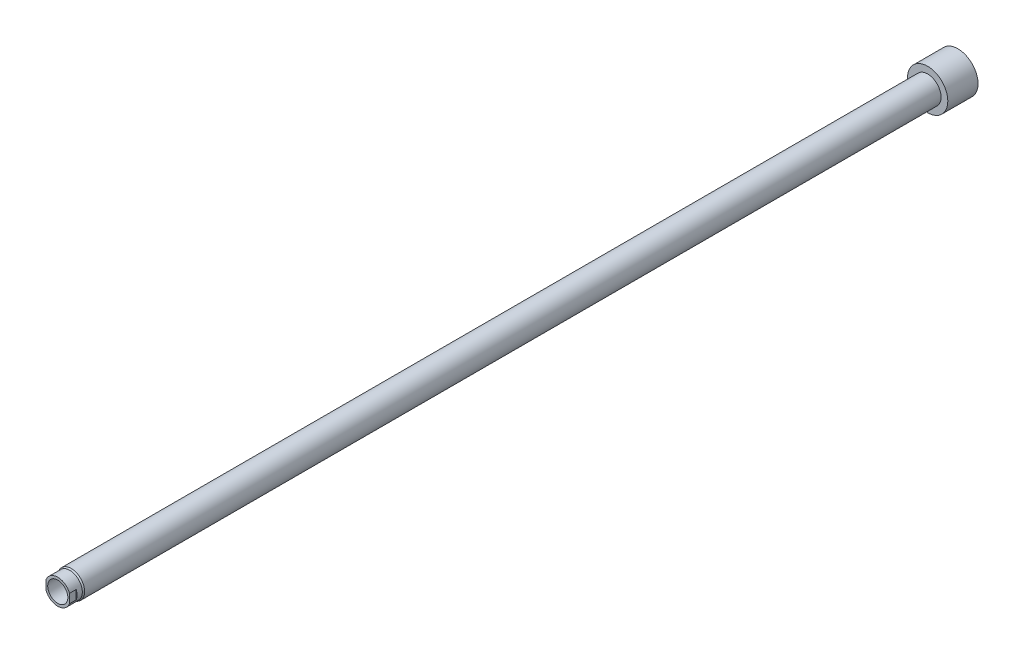
ISO-10303-21;
HEADER;
FILE_DESCRIPTION(('STEP AP214'),'2;1');
FILE_NAME('part.step','',(''),(''),'','','');
FILE_SCHEMA(('AUTOMOTIVE_DESIGN { 1 0 10303 214 1 1 1 1 }'));
ENDSEC;
DATA;
#1=APPLICATION_CONTEXT('core data for automotive mechanical design processes');
#2=APPLICATION_PROTOCOL_DEFINITION('international standard','automotive_design',2000,#1);
#3=PRODUCT_CONTEXT('',#1,'mechanical');
#4=PRODUCT('Part','Part','',(#3));
#5=PRODUCT_RELATED_PRODUCT_CATEGORY('part','',(#4));
#6=PRODUCT_DEFINITION_FORMATION('','',#4);
#7=PRODUCT_DEFINITION_CONTEXT('part definition',#1,'design');
#8=PRODUCT_DEFINITION('design','',#6,#7);
#9=PRODUCT_DEFINITION_SHAPE('','',#8);
#10=(LENGTH_UNIT() NAMED_UNIT(*) SI_UNIT(.MILLI.,.METRE.));
#11=(NAMED_UNIT(*) PLANE_ANGLE_UNIT() SI_UNIT($,.RADIAN.));
#12=(NAMED_UNIT(*) SI_UNIT($,.STERADIAN.) SOLID_ANGLE_UNIT());
#13=UNCERTAINTY_MEASURE_WITH_UNIT(LENGTH_MEASURE(1.E-05),#10,'distance_accuracy_value','');
#14=(GEOMETRIC_REPRESENTATION_CONTEXT(3) GLOBAL_UNCERTAINTY_ASSIGNED_CONTEXT((#13)) GLOBAL_UNIT_ASSIGNED_CONTEXT((#10,
#11,#12)) REPRESENTATION_CONTEXT('',''));
#15=CARTESIAN_POINT('',(0.,0.,0.));
#16=DIRECTION('',(0.,0.,1.));
#17=DIRECTION('',(1.,0.,0.));
#18=AXIS2_PLACEMENT_3D('',#15,#16,#17);
#19=CARTESIAN_POINT('',(0.,0.,38.1));
#20=DIRECTION('',(0.,0.,-1.));
#21=DIRECTION('',(-1.,0.,0.));
#22=AXIS2_PLACEMENT_3D('',#19,#20,#21);
#23=CYLINDRICAL_SURFACE('',#22,12.6999999999999);
#24=CARTESIAN_POINT('',(0.,0.,38.1));
#25=DIRECTION('',(0.,0.,1.));
#26=DIRECTION('',(1.,0.,0.));
#27=AXIS2_PLACEMENT_3D('',#24,#25,#26);
#28=CIRCLE('',#27,12.6999999999999);
#29=CARTESIAN_POINT('',(12.6999999999999,0.,38.1));
#30=VERTEX_POINT('',#29);
#31=EDGE_CURVE('E11',#30,#30,#28,.T.);
#32=ORIENTED_EDGE('',*,*,#31,.F.);
#33=EDGE_LOOP('',(#32));
#34=FACE_BOUND('',#33,.T.);
#35=CARTESIAN_POINT('',(0.,0.,-771.525));
#36=DIRECTION('',(0.,0.,1.));
#37=DIRECTION('',(1.,0.,0.));
#38=AXIS2_PLACEMENT_3D('',#35,#36,#37);
#39=CIRCLE('',#38,12.6999999999999);
#40=CARTESIAN_POINT('',(12.6999999999999,0.,-771.525));
#41=VERTEX_POINT('',#40);
#42=EDGE_CURVE('E122',#41,#41,#39,.T.);
#43=ORIENTED_EDGE('',*,*,#42,.T.);
#44=EDGE_LOOP('',(#43));
#45=FACE_BOUND('',#44,.T.);
#46=ADVANCED_FACE('F34',(#34,#45),#23,.T.);
#47=CARTESIAN_POINT('',(0.,0.,38.1));
#48=DIRECTION('',(0.,0.,-1.));
#49=DIRECTION('',(1.,0.,0.));
#50=AXIS2_PLACEMENT_3D('',#47,#48,#49);
#51=CONICAL_SURFACE('',#50,12.7000000000016,0.523598775599996);
#52=CARTESIAN_POINT('',(0.,0.,39.4748153285071));
#53=DIRECTION('',(0.,0.,1.));
#54=DIRECTION('',(1.,0.,0.));
#55=AXIS2_PLACEMENT_3D('',#52,#53,#54);
#56=CIRCLE('',#55,11.9062499999988);
#57=CARTESIAN_POINT('',(11.9062499999988,0.,39.4748153285071));
#58=VERTEX_POINT('',#57);
#59=EDGE_CURVE('E42',#58,#58,#56,.T.);
#60=ORIENTED_EDGE('',*,*,#59,.F.);
#61=EDGE_LOOP('',(#60));
#62=FACE_BOUND('',#61,.T.);
#63=ORIENTED_EDGE('',*,*,#31,.T.);
#64=EDGE_LOOP('',(#63));
#65=FACE_BOUND('',#64,.T.);
#66=ADVANCED_FACE('F112',(#62,#65),#51,.T.);
#67=CARTESIAN_POINT('',(0.,0.,50.8));
#68=DIRECTION('',(0.,0.,-1.));
#69=DIRECTION('',(-1.,0.,0.));
#70=AXIS2_PLACEMENT_3D('',#67,#68,#69);
#71=CYLINDRICAL_SURFACE('',#70,11.90625);
#72=CARTESIAN_POINT('',(0.,0.,50.8));
#73=DIRECTION('',(0.,0.,1.));
#74=DIRECTION('',(1.,0.,0.));
#75=AXIS2_PLACEMENT_3D('',#72,#73,#74);
#76=CIRCLE('',#75,11.90625);
#77=CARTESIAN_POINT('',(-11.1125,-4.27447456566303,50.8));
#78=VERTEX_POINT('',#77);
#79=CARTESIAN_POINT('',(11.1125,-4.27447456566302,50.8));
#80=VERTEX_POINT('',#79);
#81=EDGE_CURVE('E92',#78,#80,#76,.T.);
#82=ORIENTED_EDGE('',*,*,#81,.F.);
#83=DIRECTION('',(0.,0.,1.));
#84=VECTOR('',#83,1.);
#85=CARTESIAN_POINT('',(-11.1125,-4.27447456566302,44.45));
#86=LINE('',#85,#84);
#87=CARTESIAN_POINT('',(-11.1125,-4.27447456566302,44.45));
#88=VERTEX_POINT('',#87);
#89=EDGE_CURVE('E49',#88,#78,#86,.T.);
#90=ORIENTED_EDGE('',*,*,#89,.F.);
#91=CARTESIAN_POINT('',(0.,0.,44.45));
#92=DIRECTION('',(0.,0.,1.));
#93=DIRECTION('',(1.,0.,0.));
#94=AXIS2_PLACEMENT_3D('',#91,#92,#93);
#95=CIRCLE('',#94,11.90625);
#96=CARTESIAN_POINT('',(-11.1125,4.27447456566302,44.45));
#97=VERTEX_POINT('',#96);
#98=EDGE_CURVE('E78',#97,#88,#95,.T.);
#99=ORIENTED_EDGE('',*,*,#98,.F.);
#100=DIRECTION('',(0.,0.,1.));
#101=VECTOR('',#100,1.);
#102=CARTESIAN_POINT('',(-11.1125,4.27447456566302,44.45));
#103=LINE('',#102,#101);
#104=CARTESIAN_POINT('',(-11.1125,4.27447456566302,50.8));
#105=VERTEX_POINT('',#104);
#106=EDGE_CURVE('E86',#97,#105,#103,.T.);
#107=ORIENTED_EDGE('',*,*,#106,.T.);
#108=CARTESIAN_POINT('',(11.1125,4.27447456566303,50.8));
#109=VERTEX_POINT('',#108);
#110=EDGE_CURVE('E107',#109,#105,#76,.T.);
#111=ORIENTED_EDGE('',*,*,#110,.F.);
#112=DIRECTION('',(0.,0.,1.));
#113=VECTOR('',#112,1.);
#114=CARTESIAN_POINT('',(11.1125,4.27447456566302,44.45));
#115=LINE('',#114,#113);
#116=CARTESIAN_POINT('',(11.1125,4.27447456566302,44.45));
#117=VERTEX_POINT('',#116);
#118=EDGE_CURVE('E57',#117,#109,#115,.T.);
#119=ORIENTED_EDGE('',*,*,#118,.F.);
#120=CARTESIAN_POINT('',(0.,0.,44.45));
#121=DIRECTION('',(0.,0.,1.));
#122=DIRECTION('',(1.,0.,0.));
#123=AXIS2_PLACEMENT_3D('',#120,#121,#122);
#124=CIRCLE('',#123,11.90625);
#125=CARTESIAN_POINT('',(11.1125,-4.27447456566302,44.45));
#126=VERTEX_POINT('',#125);
#127=EDGE_CURVE('E98',#126,#117,#124,.T.);
#128=ORIENTED_EDGE('',*,*,#127,.F.);
#129=DIRECTION('',(0.,0.,1.));
#130=VECTOR('',#129,1.);
#131=CARTESIAN_POINT('',(11.1125,-4.27447456566302,44.45));
#132=LINE('',#131,#130);
#133=EDGE_CURVE('E104',#126,#80,#132,.T.);
#134=ORIENTED_EDGE('',*,*,#133,.T.);
#135=EDGE_LOOP('',(#82,#90,#99,#107,#111,#119,#128,#134));
#136=FACE_BOUND('',#135,.T.);
#137=ORIENTED_EDGE('',*,*,#59,.T.);
#138=EDGE_LOOP('',(#137));
#139=FACE_BOUND('',#138,.T.);
#140=ADVANCED_FACE('F89',(#136,#139),#71,.T.);
#141=CARTESIAN_POINT('',(0.,0.,50.8));
#142=DIRECTION('',(0.,0.,1.));
#143=DIRECTION('',(1.,0.,0.));
#144=AXIS2_PLACEMENT_3D('',#141,#142,#143);
#145=PLANE('',#144);
#146=CARTESIAN_POINT('',(0.,0.,50.8));
#147=DIRECTION('',(0.,0.,1.));
#148=DIRECTION('',(1.,0.,0.));
#149=AXIS2_PLACEMENT_3D('',#146,#147,#148);
#150=CIRCLE('',#149,9.525);
#151=CARTESIAN_POINT('',(9.525,0.,50.8));
#152=VERTEX_POINT('',#151);
#153=EDGE_CURVE('E132',#152,#152,#150,.T.);
#154=ORIENTED_EDGE('',*,*,#153,.F.);
#155=EDGE_LOOP('',(#154));
#156=FACE_BOUND('',#155,.T.);
#157=DIRECTION('',(0.,1.,0.));
#158=VECTOR('',#157,1.);
#159=CARTESIAN_POINT('',(-11.1125,-4.27447456566302,50.8));
#160=LINE('',#159,#158);
#161=EDGE_CURVE('E83',#78,#105,#160,.T.);
#162=ORIENTED_EDGE('',*,*,#161,.F.);
#163=ORIENTED_EDGE('',*,*,#81,.T.);
#164=DIRECTION('',(0.,-1.,0.));
#165=VECTOR('',#164,1.);
#166=CARTESIAN_POINT('',(11.1125,4.27447456566302,50.8));
#167=LINE('',#166,#165);
#168=EDGE_CURVE('E94',#109,#80,#167,.T.);
#169=ORIENTED_EDGE('',*,*,#168,.F.);
#170=ORIENTED_EDGE('',*,*,#110,.T.);
#171=EDGE_LOOP('',(#162,#163,#169,#170));
#172=FACE_BOUND('',#171,.T.);
#173=ADVANCED_FACE('F139',(#156,#172),#145,.T.);
#174=CARTESIAN_POINT('',(11.1125,4.27447456566302,44.45));
#175=DIRECTION('',(-1.,0.,0.));
#176=DIRECTION('',(0.,-1.,0.));
#177=AXIS2_PLACEMENT_3D('',#174,#175,#176);
#178=PLANE('',#177);
#179=ORIENTED_EDGE('',*,*,#168,.T.);
#180=ORIENTED_EDGE('',*,*,#133,.F.);
#181=DIRECTION('',(0.,-1.,0.));
#182=VECTOR('',#181,1.);
#183=CARTESIAN_POINT('',(11.1125,4.27447456566302,44.45));
#184=LINE('',#183,#182);
#185=EDGE_CURVE('E100',#117,#126,#184,.T.);
#186=ORIENTED_EDGE('',*,*,#185,.F.);
#187=ORIENTED_EDGE('',*,*,#118,.T.);
#188=EDGE_LOOP('',(#179,#180,#186,#187));
#189=FACE_BOUND('',#188,.T.);
#190=ADVANCED_FACE('F140',(#189),#178,.F.);
#191=CARTESIAN_POINT('',(0.,0.,44.45));
#192=DIRECTION('',(0.,0.,1.));
#193=DIRECTION('',(1.,0.,0.));
#194=AXIS2_PLACEMENT_3D('',#191,#192,#193);
#195=PLANE('',#194);
#196=ORIENTED_EDGE('',*,*,#127,.T.);
#197=ORIENTED_EDGE('',*,*,#185,.T.);
#198=EDGE_LOOP('',(#196,#197));
#199=FACE_BOUND('',#198,.T.);
#200=ADVANCED_FACE('F143',(#199),#195,.T.);
#201=CARTESIAN_POINT('',(-11.1125,-4.27447456566302,44.45));
#202=DIRECTION('',(1.,0.,0.));
#203=DIRECTION('',(0.,1.,0.));
#204=AXIS2_PLACEMENT_3D('',#201,#202,#203);
#205=PLANE('',#204);
#206=ORIENTED_EDGE('',*,*,#161,.T.);
#207=ORIENTED_EDGE('',*,*,#106,.F.);
#208=DIRECTION('',(0.,1.,0.));
#209=VECTOR('',#208,1.);
#210=CARTESIAN_POINT('',(-11.1125,-4.27447456566302,44.45));
#211=LINE('',#210,#209);
#212=EDGE_CURVE('E80',#88,#97,#211,.T.);
#213=ORIENTED_EDGE('',*,*,#212,.F.);
#214=ORIENTED_EDGE('',*,*,#89,.T.);
#215=EDGE_LOOP('',(#206,#207,#213,#214));
#216=FACE_BOUND('',#215,.T.);
#217=ADVANCED_FACE('F85',(#216),#205,.F.);
#218=CARTESIAN_POINT('',(0.,0.,44.45));
#219=DIRECTION('',(0.,0.,1.));
#220=DIRECTION('',(1.,0.,0.));
#221=AXIS2_PLACEMENT_3D('',#218,#219,#220);
#222=PLANE('',#221);
#223=ORIENTED_EDGE('',*,*,#98,.T.);
#224=ORIENTED_EDGE('',*,*,#212,.T.);
#225=EDGE_LOOP('',(#223,#224));
#226=FACE_BOUND('',#225,.T.);
#227=ADVANCED_FACE('F79',(#226),#222,.T.);
#228=CARTESIAN_POINT('',(0.,0.,22.225));
#229=DIRECTION('',(0.,0.,1.));
#230=DIRECTION('',(1.,0.,0.));
#231=AXIS2_PLACEMENT_3D('',#228,#229,#230);
#232=CYLINDRICAL_SURFACE('',#231,9.525);
#233=CARTESIAN_POINT('',(0.,0.,22.225));
#234=DIRECTION('',(0.,0.,1.));
#235=DIRECTION('',(1.,0.,0.));
#236=AXIS2_PLACEMENT_3D('',#233,#234,#235);
#237=CIRCLE('',#236,9.525);
#238=CARTESIAN_POINT('',(9.525,0.,22.225));
#239=VERTEX_POINT('',#238);
#240=EDGE_CURVE('E133',#239,#239,#237,.T.);
#241=ORIENTED_EDGE('',*,*,#240,.F.);
#242=EDGE_LOOP('',(#241));
#243=FACE_BOUND('',#242,.T.);
#244=ORIENTED_EDGE('',*,*,#153,.T.);
#245=EDGE_LOOP('',(#244));
#246=FACE_BOUND('',#245,.T.);
#247=ADVANCED_FACE('F192',(#243,#246),#232,.F.);
#248=CARTESIAN_POINT('',(0.,0.,22.225));
#249=DIRECTION('',(0.,0.,1.));
#250=DIRECTION('',(1.,0.,0.));
#251=AXIS2_PLACEMENT_3D('',#248,#249,#250);
#252=PLANE('',#251);
#253=ORIENTED_EDGE('',*,*,#240,.T.);
#254=EDGE_LOOP('',(#253));
#255=FACE_BOUND('',#254,.T.);
#256=ADVANCED_FACE('F198',(#255),#252,.T.);
#257=CARTESIAN_POINT('',(0.,0.,-771.525));
#258=DIRECTION('',(0.,0.,1.));
#259=DIRECTION('',(1.,0.,0.));
#260=AXIS2_PLACEMENT_3D('',#257,#258,#259);
#261=PLANE('',#260);
#262=ORIENTED_EDGE('',*,*,#42,.F.);
#263=EDGE_LOOP('',(#262));
#264=FACE_BOUND('',#263,.T.);
#265=CARTESIAN_POINT('',(0.,0.,-771.525));
#266=DIRECTION('',(0.,0.,1.));
#267=DIRECTION('',(1.,0.,0.));
#268=AXIS2_PLACEMENT_3D('',#265,#266,#267);
#269=CIRCLE('',#268,19.05);
#270=CARTESIAN_POINT('',(19.05,0.,-771.525));
#271=VERTEX_POINT('',#270);
#272=EDGE_CURVE('E124',#271,#271,#269,.T.);
#273=ORIENTED_EDGE('',*,*,#272,.T.);
#274=EDGE_LOOP('',(#273));
#275=FACE_BOUND('',#274,.T.);
#276=ADVANCED_FACE('F207',(#264,#275),#261,.T.);
#277=CARTESIAN_POINT('',(0.,0.,-800.1));
#278=DIRECTION('',(0.,0.,-1.));
#279=DIRECTION('',(-1.,0.,0.));
#280=AXIS2_PLACEMENT_3D('',#277,#278,#279);
#281=PLANE('',#280);
#282=CARTESIAN_POINT('',(0.,0.,-800.1));
#283=DIRECTION('',(0.,0.,-1.));
#284=DIRECTION('',(-1.,0.,0.));
#285=AXIS2_PLACEMENT_3D('',#282,#283,#284);
#286=CIRCLE('',#285,19.05);
#287=CARTESIAN_POINT('',(-19.05,0.,-800.1));
#288=VERTEX_POINT('',#287);
#289=EDGE_CURVE('E127',#288,#288,#286,.T.);
#290=ORIENTED_EDGE('',*,*,#289,.T.);
#291=EDGE_LOOP('',(#290));
#292=FACE_BOUND('',#291,.T.);
#293=ADVANCED_FACE('F212',(#292),#281,.T.);
#294=CARTESIAN_POINT('',(0.,0.,-657.225));
#295=DIRECTION('',(0.,0.,-1.));
#296=DIRECTION('',(-1.,0.,0.));
#297=AXIS2_PLACEMENT_3D('',#294,#295,#296);
#298=CYLINDRICAL_SURFACE('',#297,19.05);
#299=ORIENTED_EDGE('',*,*,#289,.F.);
#300=EDGE_LOOP('',(#299));
#301=FACE_BOUND('',#300,.T.);
#302=ORIENTED_EDGE('',*,*,#272,.F.);
#303=EDGE_LOOP('',(#302));
#304=FACE_BOUND('',#303,.T.);
#305=ADVANCED_FACE('F36',(#301,#304),#298,.T.);
#306=CLOSED_SHELL('',(#46,#66,#140,#173,#190,#200,#217,#227,#247,#256,#276,#293,#305));
#307=MANIFOLD_SOLID_BREP('B2',#306);
#308=ADVANCED_BREP_SHAPE_REPRESENTATION('',(#18,#307),#14);
#309=SHAPE_DEFINITION_REPRESENTATION(#9,#308);
ENDSEC;
END-ISO-10303-21;
